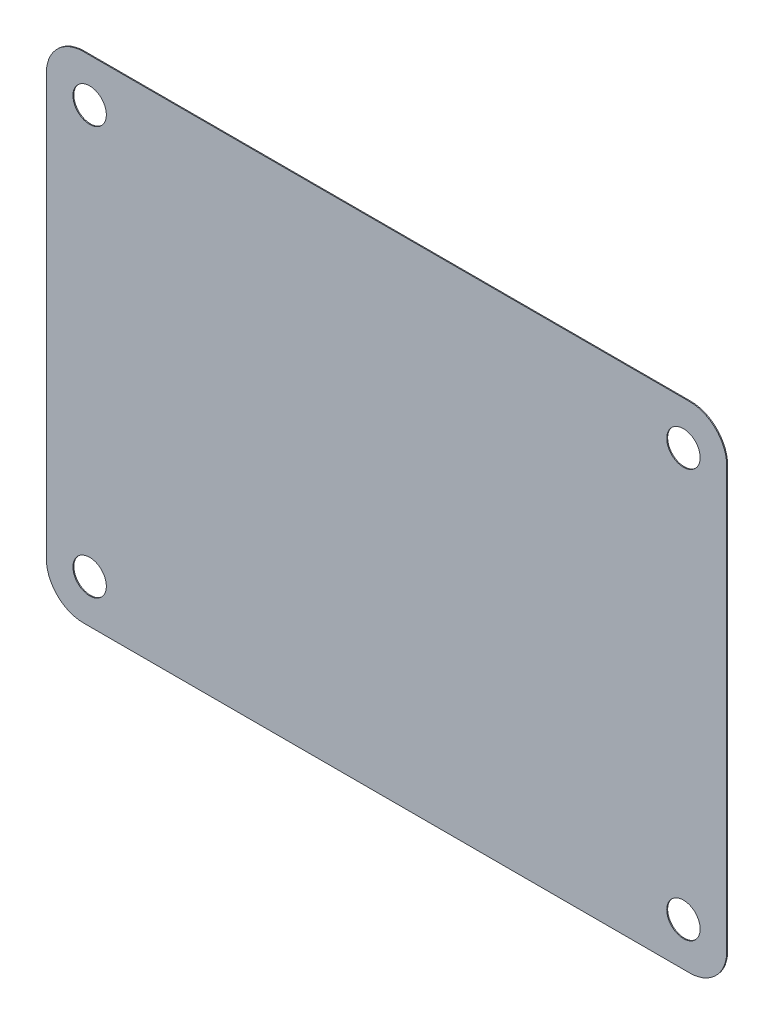
ISO-10303-21;
HEADER;
FILE_DESCRIPTION(('STEP AP214'),'2;1');
FILE_NAME('part.step','',(''),(''),'','','');
FILE_SCHEMA(('AUTOMOTIVE_DESIGN { 1 0 10303 214 1 1 1 1 }'));
ENDSEC;
DATA;
#1=APPLICATION_CONTEXT('core data for automotive mechanical design processes');
#2=APPLICATION_PROTOCOL_DEFINITION('international standard','automotive_design',2000,#1);
#3=PRODUCT_CONTEXT('',#1,'mechanical');
#4=PRODUCT('Part','Part','',(#3));
#5=PRODUCT_RELATED_PRODUCT_CATEGORY('part','',(#4));
#6=PRODUCT_DEFINITION_FORMATION('','',#4);
#7=PRODUCT_DEFINITION_CONTEXT('part definition',#1,'design');
#8=PRODUCT_DEFINITION('design','',#6,#7);
#9=PRODUCT_DEFINITION_SHAPE('','',#8);
#10=(LENGTH_UNIT() NAMED_UNIT(*) SI_UNIT(.MILLI.,.METRE.));
#11=(NAMED_UNIT(*) PLANE_ANGLE_UNIT() SI_UNIT($,.RADIAN.));
#12=(NAMED_UNIT(*) SI_UNIT($,.STERADIAN.) SOLID_ANGLE_UNIT());
#13=UNCERTAINTY_MEASURE_WITH_UNIT(LENGTH_MEASURE(1.E-05),#10,'distance_accuracy_value','');
#14=(GEOMETRIC_REPRESENTATION_CONTEXT(3) GLOBAL_UNCERTAINTY_ASSIGNED_CONTEXT((#13)) GLOBAL_UNIT_ASSIGNED_CONTEXT((#10,
#11,#12)) REPRESENTATION_CONTEXT('',''));
#15=CARTESIAN_POINT('',(0.,0.,0.));
#16=DIRECTION('',(0.,0.,1.));
#17=DIRECTION('',(1.,0.,0.));
#18=AXIS2_PLACEMENT_3D('',#15,#16,#17);
#19=CARTESIAN_POINT('',(27.499999555869,35.999999598533,0.1394000001));
#20=DIRECTION('',(0.,0.,1.));
#21=DIRECTION('',(1.,0.,0.));
#22=AXIS2_PLACEMENT_3D('',#19,#20,#21);
#23=PLANE('',#22);
#24=CARTESIAN_POINT('',(51.500000136726,52.499998525994,0.1394000001));
#25=DIRECTION('',(0.,0.,-1.));
#26=DIRECTION('',(1.,0.,0.));
#27=AXIS2_PLACEMENT_3D('',#24,#25,#26);
#28=CIRCLE('',#27,1.349999863275);
#29=CARTESIAN_POINT('',(52.850000000001,52.499998525994,0.1394000001));
#30=VERTEX_POINT('',#29);
#31=CARTESIAN_POINT('',(50.150000273451,52.499998525994,0.1394000001));
#32=VERTEX_POINT('',#31);
#33=EDGE_CURVE('E252',#30,#32,#28,.T.);
#34=ORIENTED_EDGE('',*,*,#33,.T.);
#35=CARTESIAN_POINT('',(51.500000136726,52.499998525994,0.1394000001));
#36=DIRECTION('',(0.,0.,-1.));
#37=DIRECTION('',(1.,0.,0.));
#38=AXIS2_PLACEMENT_3D('',#35,#36,#37);
#39=CIRCLE('',#38,1.349999863275);
#40=EDGE_CURVE('E11',#32,#30,#39,.T.);
#41=ORIENTED_EDGE('',*,*,#40,.T.);
#42=EDGE_LOOP('',(#34,#41));
#43=FACE_BOUND('',#42,.T.);
#44=CARTESIAN_POINT('',(3.500000092163,52.499999091341,0.1394000001));
#45=DIRECTION('',(0.,0.,-1.));
#46=DIRECTION('',(1.,0.,0.));
#47=AXIS2_PLACEMENT_3D('',#44,#45,#46);
#48=CIRCLE('',#47,1.349999907837);
#49=CARTESIAN_POINT('',(4.85,52.499999091341,0.1394000001));
#50=VERTEX_POINT('',#49);
#51=CARTESIAN_POINT('',(2.150000184326,52.499999091341,0.1394000001));
#52=VERTEX_POINT('',#51);
#53=EDGE_CURVE('E244',#50,#52,#48,.T.);
#54=ORIENTED_EDGE('',*,*,#53,.T.);
#55=CARTESIAN_POINT('',(3.500000092163,52.499999091341,0.1394000001));
#56=DIRECTION('',(0.,0.,-1.));
#57=DIRECTION('',(1.,0.,0.));
#58=AXIS2_PLACEMENT_3D('',#55,#56,#57);
#59=CIRCLE('',#58,1.349999907837);
#60=EDGE_CURVE('E28',#52,#50,#59,.T.);
#61=ORIENTED_EDGE('',*,*,#60,.T.);
#62=EDGE_LOOP('',(#54,#61));
#63=FACE_BOUND('',#62,.T.);
#64=CARTESIAN_POINT('',(51.500000136726,19.499998525994,0.1394000001));
#65=DIRECTION('',(0.,0.,-1.));
#66=DIRECTION('',(1.,0.,0.));
#67=AXIS2_PLACEMENT_3D('',#64,#65,#66);
#68=CIRCLE('',#67,1.349999863275);
#69=CARTESIAN_POINT('',(52.850000000001,19.499998525994,0.1394000001));
#70=VERTEX_POINT('',#69);
#71=CARTESIAN_POINT('',(50.150000273451,19.499998525994,0.1394000001));
#72=VERTEX_POINT('',#71);
#73=EDGE_CURVE('E226',#70,#72,#68,.T.);
#74=ORIENTED_EDGE('',*,*,#73,.T.);
#75=CARTESIAN_POINT('',(51.500000136726,19.499998525994,0.1394000001));
#76=DIRECTION('',(0.,0.,-1.));
#77=DIRECTION('',(1.,0.,0.));
#78=AXIS2_PLACEMENT_3D('',#75,#76,#77);
#79=CIRCLE('',#78,1.349999863275);
#80=EDGE_CURVE('E151',#72,#70,#79,.T.);
#81=ORIENTED_EDGE('',*,*,#80,.T.);
#82=EDGE_LOOP('',(#74,#81));
#83=FACE_BOUND('',#82,.T.);
#84=CARTESIAN_POINT('',(3.499999780028,19.496399991386,0.1394000001));
#85=DIRECTION('',(0.,0.,-1.));
#86=DIRECTION('',(1.,0.,0.));
#87=AXIS2_PLACEMENT_3D('',#84,#85,#86);
#88=CIRCLE('',#87,1.350000219972);
#89=CARTESIAN_POINT('',(4.85,19.496399991386,0.1394000001));
#90=VERTEX_POINT('',#89);
#91=CARTESIAN_POINT('',(2.149999560056,19.496399991386,0.1394000001));
#92=VERTEX_POINT('',#91);
#93=EDGE_CURVE('E239',#90,#92,#88,.T.);
#94=ORIENTED_EDGE('',*,*,#93,.T.);
#95=CARTESIAN_POINT('',(3.499999780028,19.496399991386,0.1394000001));
#96=DIRECTION('',(0.,0.,-1.));
#97=DIRECTION('',(1.,0.,0.));
#98=AXIS2_PLACEMENT_3D('',#95,#96,#97);
#99=CIRCLE('',#98,1.350000219972);
#100=EDGE_CURVE('E321',#92,#90,#99,.T.);
#101=ORIENTED_EDGE('',*,*,#100,.T.);
#102=EDGE_LOOP('',(#94,#101));
#103=FACE_BOUND('',#102,.T.);
#104=DIRECTION('',(0.,1.,0.));
#105=VECTOR('',#104,1.);
#106=CARTESIAN_POINT('',(55.,53.,0.1394000001));
#107=LINE('',#106,#105);
#108=CARTESIAN_POINT('',(55.,19.000001303345,0.1394000001));
#109=VERTEX_POINT('',#108);
#110=CARTESIAN_POINT('',(55.000000000004,52.999993225551,0.1394000001));
#111=VERTEX_POINT('',#110);
#112=EDGE_CURVE('E259',#109,#111,#107,.T.);
#113=ORIENTED_EDGE('',*,*,#112,.T.);
#114=CARTESIAN_POINT('',(51.999993225551,52.999993225551,0.1394000001));
#115=DIRECTION('',(0.,0.,-1.));
#116=DIRECTION('',(1.,0.,0.));
#117=AXIS2_PLACEMENT_3D('',#114,#115,#116);
#118=CIRCLE('',#117,3.000006774456);
#119=CARTESIAN_POINT('',(51.999996612776,56.,0.1394000001));
#120=VERTEX_POINT('',#119);
#121=EDGE_CURVE('E286',#120,#111,#118,.T.);
#122=ORIENTED_EDGE('',*,*,#121,.F.);
#123=DIRECTION('',(-1.,0.,0.));
#124=VECTOR('',#123,1.);
#125=CARTESIAN_POINT('',(3.,56.,0.1394000001));
#126=LINE('',#125,#124);
#127=CARTESIAN_POINT('',(3.000001694072,56.,0.1394000001));
#128=VERTEX_POINT('',#127);
#129=EDGE_CURVE('E290',#120,#128,#126,.T.);
#130=ORIENTED_EDGE('',*,*,#129,.T.);
#131=CARTESIAN_POINT('',(3.000003388144,52.999996611856,0.1394000001));
#132=DIRECTION('',(0.,0.,-1.));
#133=DIRECTION('',(1.,0.,0.));
#134=AXIS2_PLACEMENT_3D('',#131,#132,#133);
#135=CIRCLE('',#134,3.000003388146);
#136=CARTESIAN_POINT('',(0.,52.999998305928,0.1394000001));
#137=VERTEX_POINT('',#136);
#138=EDGE_CURVE('E42',#137,#128,#135,.T.);
#139=ORIENTED_EDGE('',*,*,#138,.F.);
#140=DIRECTION('',(0.,-1.,0.));
#141=VECTOR('',#140,1.);
#142=CARTESIAN_POINT('',(0.,19.,0.1394000001));
#143=LINE('',#142,#141);
#144=CARTESIAN_POINT('',(0.,18.9999996102,0.1394000001));
#145=VERTEX_POINT('',#144);
#146=EDGE_CURVE('E222',#137,#145,#143,.T.);
#147=ORIENTED_EDGE('',*,*,#146,.T.);
#148=CARTESIAN_POINT('',(2.999999220399,18.9999992204,0.1394000001));
#149=DIRECTION('',(0.,0.,-1.));
#150=DIRECTION('',(1.,0.,0.));
#151=AXIS2_PLACEMENT_3D('',#148,#149,#150);
#152=CIRCLE('',#151,2.9999992204);
#153=CARTESIAN_POINT('',(2.9999996102,16.,0.1394000001));
#154=VERTEX_POINT('',#153);
#155=EDGE_CURVE('E292',#154,#145,#152,.T.);
#156=ORIENTED_EDGE('',*,*,#155,.F.);
#157=DIRECTION('',(1.,0.,0.));
#158=VECTOR('',#157,1.);
#159=CARTESIAN_POINT('',(52.,16.,0.1394000001));
#160=LINE('',#159,#158);
#161=CARTESIAN_POINT('',(51.999998696655,16.,0.1394000001));
#162=VERTEX_POINT('',#161);
#163=EDGE_CURVE('E125',#154,#162,#160,.T.);
#164=ORIENTED_EDGE('',*,*,#163,.T.);
#165=CARTESIAN_POINT('',(51.999997393309,19.00000260669,0.1394000001));
#166=DIRECTION('',(0.,0.,-1.));
#167=DIRECTION('',(1.,0.,0.));
#168=AXIS2_PLACEMENT_3D('',#165,#166,#167);
#169=CIRCLE('',#168,3.000002606692);
#170=EDGE_CURVE('E133',#109,#162,#169,.T.);
#171=ORIENTED_EDGE('',*,*,#170,.F.);
#172=EDGE_LOOP('',(#113,#122,#130,#139,#147,#156,#164,#171));
#173=FACE_BOUND('',#172,.T.);
#174=ADVANCED_FACE('F17',(#43,#63,#83,#103,#173),#23,.T.);
#175=CARTESIAN_POINT('',(51.500000136726,52.499998525994,0.0654000001));
#176=DIRECTION('',(0.,0.,1.));
#177=DIRECTION('',(1.,0.,0.));
#178=AXIS2_PLACEMENT_3D('',#175,#176,#177);
#179=CYLINDRICAL_SURFACE('',#178,1.349999863275);
#180=DIRECTION('',(0.,0.,1.));
#181=VECTOR('',#180,1.);
#182=CARTESIAN_POINT('',(50.150000273451,52.499998525994,0.0654000001));
#183=LINE('',#182,#181);
#184=CARTESIAN_POINT('',(50.150000273451,52.499998525994,0.0654000001));
#185=VERTEX_POINT('',#184);
#186=EDGE_CURVE('E232',#185,#32,#183,.T.);
#187=ORIENTED_EDGE('',*,*,#186,.F.);
#188=CARTESIAN_POINT('',(51.500000136726,52.499998525994,0.0654000001));
#189=DIRECTION('',(0.,0.,-1.));
#190=DIRECTION('',(1.,0.,0.));
#191=AXIS2_PLACEMENT_3D('',#188,#189,#190);
#192=CIRCLE('',#191,1.349999863275);
#193=CARTESIAN_POINT('',(52.850000000001,52.499998525994,0.0654000001));
#194=VERTEX_POINT('',#193);
#195=EDGE_CURVE('E310',#185,#194,#192,.T.);
#196=ORIENTED_EDGE('',*,*,#195,.T.);
#197=DIRECTION('',(0.,0.,1.));
#198=VECTOR('',#197,1.);
#199=CARTESIAN_POINT('',(52.850000000001,52.499998525994,0.0654000001));
#200=LINE('',#199,#198);
#201=EDGE_CURVE('E256',#194,#30,#200,.T.);
#202=ORIENTED_EDGE('',*,*,#201,.T.);
#203=ORIENTED_EDGE('',*,*,#40,.F.);
#204=EDGE_LOOP('',(#187,#196,#202,#203));
#205=FACE_BOUND('',#204,.T.);
#206=ADVANCED_FACE('F377',(#205),#179,.F.);
#207=CARTESIAN_POINT('',(3.500000092163,52.499999091341,0.0654000001));
#208=DIRECTION('',(0.,0.,1.));
#209=DIRECTION('',(1.,0.,0.));
#210=AXIS2_PLACEMENT_3D('',#207,#208,#209);
#211=CYLINDRICAL_SURFACE('',#210,1.349999907837);
#212=DIRECTION('',(0.,0.,1.));
#213=VECTOR('',#212,1.);
#214=CARTESIAN_POINT('',(2.150000184326,52.499999091341,0.0654000001));
#215=LINE('',#214,#213);
#216=CARTESIAN_POINT('',(2.150000184326,52.499999091341,0.0654000001));
#217=VERTEX_POINT('',#216);
#218=EDGE_CURVE('E240',#217,#52,#215,.T.);
#219=ORIENTED_EDGE('',*,*,#218,.F.);
#220=CARTESIAN_POINT('',(3.500000092163,52.499999091341,0.0654000001));
#221=DIRECTION('',(0.,0.,-1.));
#222=DIRECTION('',(1.,0.,0.));
#223=AXIS2_PLACEMENT_3D('',#220,#221,#222);
#224=CIRCLE('',#223,1.349999907837);
#225=CARTESIAN_POINT('',(4.85,52.499999091341,0.0654000001));
#226=VERTEX_POINT('',#225);
#227=EDGE_CURVE('E313',#217,#226,#224,.T.);
#228=ORIENTED_EDGE('',*,*,#227,.T.);
#229=DIRECTION('',(0.,0.,1.));
#230=VECTOR('',#229,1.);
#231=CARTESIAN_POINT('',(4.85,52.499999091341,0.0654000001));
#232=LINE('',#231,#230);
#233=EDGE_CURVE('E233',#226,#50,#232,.T.);
#234=ORIENTED_EDGE('',*,*,#233,.T.);
#235=ORIENTED_EDGE('',*,*,#60,.F.);
#236=EDGE_LOOP('',(#219,#228,#234,#235));
#237=FACE_BOUND('',#236,.T.);
#238=ADVANCED_FACE('F425',(#237),#211,.F.);
#239=CARTESIAN_POINT('',(51.500000136726,19.499998525994,0.0654000001));
#240=DIRECTION('',(0.,0.,1.));
#241=DIRECTION('',(1.,0.,0.));
#242=AXIS2_PLACEMENT_3D('',#239,#240,#241);
#243=CYLINDRICAL_SURFACE('',#242,1.349999863275);
#244=DIRECTION('',(0.,0.,1.));
#245=VECTOR('',#244,1.);
#246=CARTESIAN_POINT('',(50.150000273451,19.499998525994,0.0654000001));
#247=LINE('',#246,#245);
#248=CARTESIAN_POINT('',(50.150000273451,19.499998525994,0.0654000001));
#249=VERTEX_POINT('',#248);
#250=EDGE_CURVE('E245',#249,#72,#247,.T.);
#251=ORIENTED_EDGE('',*,*,#250,.F.);
#252=CARTESIAN_POINT('',(51.500000136726,19.499998525994,0.0654000001));
#253=DIRECTION('',(0.,0.,-1.));
#254=DIRECTION('',(1.,0.,0.));
#255=AXIS2_PLACEMENT_3D('',#252,#253,#254);
#256=CIRCLE('',#255,1.349999863275);
#257=CARTESIAN_POINT('',(52.850000000001,19.499998525994,0.0654000001));
#258=VERTEX_POINT('',#257);
#259=EDGE_CURVE('E341',#249,#258,#256,.T.);
#260=ORIENTED_EDGE('',*,*,#259,.T.);
#261=DIRECTION('',(0.,0.,1.));
#262=VECTOR('',#261,1.);
#263=CARTESIAN_POINT('',(52.850000000001,19.499998525994,0.0654000001));
#264=LINE('',#263,#262);
#265=EDGE_CURVE('E223',#258,#70,#264,.T.);
#266=ORIENTED_EDGE('',*,*,#265,.T.);
#267=ORIENTED_EDGE('',*,*,#80,.F.);
#268=EDGE_LOOP('',(#251,#260,#266,#267));
#269=FACE_BOUND('',#268,.T.);
#270=ADVANCED_FACE('F421',(#269),#243,.F.);
#271=CARTESIAN_POINT('',(3.499999780028,19.496399991386,0.0654000001));
#272=DIRECTION('',(0.,0.,1.));
#273=DIRECTION('',(1.,0.,0.));
#274=AXIS2_PLACEMENT_3D('',#271,#272,#273);
#275=CYLINDRICAL_SURFACE('',#274,1.350000219972);
#276=DIRECTION('',(0.,0.,1.));
#277=VECTOR('',#276,1.);
#278=CARTESIAN_POINT('',(2.149999560056,19.496399991386,0.0654000001));
#279=LINE('',#278,#277);
#280=CARTESIAN_POINT('',(2.149999560056,19.496399991386,0.0654000001));
#281=VERTEX_POINT('',#280);
#282=EDGE_CURVE('E306',#281,#92,#279,.T.);
#283=ORIENTED_EDGE('',*,*,#282,.F.);
#284=CARTESIAN_POINT('',(3.499999780028,19.496399991386,0.0654000001));
#285=DIRECTION('',(0.,0.,-1.));
#286=DIRECTION('',(1.,0.,0.));
#287=AXIS2_PLACEMENT_3D('',#284,#285,#286);
#288=CIRCLE('',#287,1.350000219972);
#289=CARTESIAN_POINT('',(4.85,19.496399991386,0.0654000001));
#290=VERTEX_POINT('',#289);
#291=EDGE_CURVE('E21',#281,#290,#288,.T.);
#292=ORIENTED_EDGE('',*,*,#291,.T.);
#293=DIRECTION('',(0.,0.,1.));
#294=VECTOR('',#293,1.);
#295=CARTESIAN_POINT('',(4.85,19.496399991386,0.0654000001));
#296=LINE('',#295,#294);
#297=EDGE_CURVE('E234',#290,#90,#296,.T.);
#298=ORIENTED_EDGE('',*,*,#297,.T.);
#299=ORIENTED_EDGE('',*,*,#100,.F.);
#300=EDGE_LOOP('',(#283,#292,#298,#299));
#301=FACE_BOUND('',#300,.T.);
#302=ADVANCED_FACE('F374',(#301),#275,.F.);
#303=CARTESIAN_POINT('',(3.000003388144,52.999996611856,0.0654000001));
#304=DIRECTION('',(0.,0.,1.));
#305=DIRECTION('',(1.,0.,0.));
#306=AXIS2_PLACEMENT_3D('',#303,#304,#305);
#307=CYLINDRICAL_SURFACE('',#306,3.000003388146);
#308=CARTESIAN_POINT('',(3.000003388144,52.999996611856,0.0654000001));
#309=DIRECTION('',(0.,0.,1.));
#310=DIRECTION('',(1.,0.,0.));
#311=AXIS2_PLACEMENT_3D('',#308,#309,#310);
#312=CIRCLE('',#311,3.000003388146);
#313=CARTESIAN_POINT('',(3.000001694072,56.,0.0654000001));
#314=VERTEX_POINT('',#313);
#315=CARTESIAN_POINT('',(0.,52.999998305928,0.0654000001));
#316=VERTEX_POINT('',#315);
#317=EDGE_CURVE('E260',#314,#316,#312,.T.);
#318=ORIENTED_EDGE('',*,*,#317,.T.);
#319=DIRECTION('',(0.,0.,1.));
#320=VECTOR('',#319,1.);
#321=CARTESIAN_POINT('',(0.,53.,0.0654000001));
#322=LINE('',#321,#320);
#323=EDGE_CURVE('E218',#316,#137,#322,.T.);
#324=ORIENTED_EDGE('',*,*,#323,.T.);
#325=ORIENTED_EDGE('',*,*,#138,.T.);
#326=DIRECTION('',(0.,0.,-1.));
#327=VECTOR('',#326,1.);
#328=CARTESIAN_POINT('',(3.,56.,0.0654000001));
#329=LINE('',#328,#327);
#330=EDGE_CURVE('E287',#128,#314,#329,.T.);
#331=ORIENTED_EDGE('',*,*,#330,.T.);
#332=EDGE_LOOP('',(#318,#324,#325,#331));
#333=FACE_BOUND('',#332,.T.);
#334=ADVANCED_FACE('F432',(#333),#307,.T.);
#335=CARTESIAN_POINT('',(0.,19.,0.0654000001));
#336=DIRECTION('',(1.,0.,0.));
#337=DIRECTION('',(0.,1.,0.));
#338=AXIS2_PLACEMENT_3D('',#335,#336,#337);
#339=PLANE('',#338);
#340=ORIENTED_EDGE('',*,*,#323,.F.);
#341=DIRECTION('',(0.,-1.,0.));
#342=VECTOR('',#341,1.);
#343=CARTESIAN_POINT('',(0.,35.999999598533,0.0654000001));
#344=LINE('',#343,#342);
#345=CARTESIAN_POINT('',(0.,18.9999996102,0.0654000001));
#346=VERTEX_POINT('',#345);
#347=EDGE_CURVE('E200',#316,#346,#344,.T.);
#348=ORIENTED_EDGE('',*,*,#347,.T.);
#349=DIRECTION('',(0.,0.,-1.));
#350=VECTOR('',#349,1.);
#351=CARTESIAN_POINT('',(0.,19.,0.0654000001));
#352=LINE('',#351,#350);
#353=EDGE_CURVE('E177',#145,#346,#352,.T.);
#354=ORIENTED_EDGE('',*,*,#353,.F.);
#355=ORIENTED_EDGE('',*,*,#146,.F.);
#356=EDGE_LOOP('',(#340,#348,#354,#355));
#357=FACE_BOUND('',#356,.T.);
#358=ADVANCED_FACE('F536',(#357),#339,.F.);
#359=CARTESIAN_POINT('',(2.999999220399,18.9999992204,0.0654000001));
#360=DIRECTION('',(0.,0.,1.));
#361=DIRECTION('',(1.,0.,0.));
#362=AXIS2_PLACEMENT_3D('',#359,#360,#361);
#363=CYLINDRICAL_SURFACE('',#362,2.9999992204);
#364=CARTESIAN_POINT('',(2.999999220399,18.9999992204,0.0654000001));
#365=DIRECTION('',(0.,0.,1.));
#366=DIRECTION('',(1.,0.,0.));
#367=AXIS2_PLACEMENT_3D('',#364,#365,#366);
#368=CIRCLE('',#367,2.9999992204);
#369=CARTESIAN_POINT('',(2.9999996102,16.,0.0654000001));
#370=VERTEX_POINT('',#369);
#371=EDGE_CURVE('E195',#346,#370,#368,.T.);
#372=ORIENTED_EDGE('',*,*,#371,.T.);
#373=DIRECTION('',(0.,0.,1.));
#374=VECTOR('',#373,1.);
#375=CARTESIAN_POINT('',(3.,16.,0.0654000001));
#376=LINE('',#375,#374);
#377=EDGE_CURVE('E186',#370,#154,#376,.T.);
#378=ORIENTED_EDGE('',*,*,#377,.T.);
#379=ORIENTED_EDGE('',*,*,#155,.T.);
#380=ORIENTED_EDGE('',*,*,#353,.T.);
#381=EDGE_LOOP('',(#372,#378,#379,#380));
#382=FACE_BOUND('',#381,.T.);
#383=ADVANCED_FACE('F196',(#382),#363,.T.);
#384=CARTESIAN_POINT('',(52.,16.,0.0654000001));
#385=DIRECTION('',(0.,1.,0.));
#386=DIRECTION('',(1.,0.,0.));
#387=AXIS2_PLACEMENT_3D('',#384,#385,#386);
#388=PLANE('',#387);
#389=ORIENTED_EDGE('',*,*,#377,.F.);
#390=DIRECTION('',(1.,0.,0.));
#391=VECTOR('',#390,1.);
#392=CARTESIAN_POINT('',(27.499999555869,16.,0.0654000001));
#393=LINE('',#392,#391);
#394=CARTESIAN_POINT('',(51.999998696655,16.,0.0654000001));
#395=VERTEX_POINT('',#394);
#396=EDGE_CURVE('E189',#370,#395,#393,.T.);
#397=ORIENTED_EDGE('',*,*,#396,.T.);
#398=DIRECTION('',(0.,0.,-1.));
#399=VECTOR('',#398,1.);
#400=CARTESIAN_POINT('',(52.,16.,0.0654000001));
#401=LINE('',#400,#399);
#402=EDGE_CURVE('E192',#162,#395,#401,.T.);
#403=ORIENTED_EDGE('',*,*,#402,.F.);
#404=ORIENTED_EDGE('',*,*,#163,.F.);
#405=EDGE_LOOP('',(#389,#397,#403,#404));
#406=FACE_BOUND('',#405,.T.);
#407=ADVANCED_FACE('F187',(#406),#388,.F.);
#408=CARTESIAN_POINT('',(51.999997393309,19.00000260669,0.0654000001));
#409=DIRECTION('',(0.,0.,1.));
#410=DIRECTION('',(1.,0.,0.));
#411=AXIS2_PLACEMENT_3D('',#408,#409,#410);
#412=CYLINDRICAL_SURFACE('',#411,3.000002606692);
#413=CARTESIAN_POINT('',(51.999997393309,19.00000260669,0.0654000001));
#414=DIRECTION('',(0.,0.,1.));
#415=DIRECTION('',(1.,0.,0.));
#416=AXIS2_PLACEMENT_3D('',#413,#414,#415);
#417=CIRCLE('',#416,3.000002606692);
#418=CARTESIAN_POINT('',(55.,19.000001303345,0.0654000001));
#419=VERTEX_POINT('',#418);
#420=EDGE_CURVE('E206',#395,#419,#417,.T.);
#421=ORIENTED_EDGE('',*,*,#420,.T.);
#422=DIRECTION('',(0.,0.,1.));
#423=VECTOR('',#422,1.);
#424=CARTESIAN_POINT('',(55.,19.,0.0654000001));
#425=LINE('',#424,#423);
#426=EDGE_CURVE('E285',#419,#109,#425,.T.);
#427=ORIENTED_EDGE('',*,*,#426,.T.);
#428=ORIENTED_EDGE('',*,*,#170,.T.);
#429=ORIENTED_EDGE('',*,*,#402,.T.);
#430=EDGE_LOOP('',(#421,#427,#428,#429));
#431=FACE_BOUND('',#430,.T.);
#432=ADVANCED_FACE('F384',(#431),#412,.T.);
#433=CARTESIAN_POINT('',(55.,53.,0.0654000001));
#434=DIRECTION('',(-1.,0.,0.));
#435=DIRECTION('',(0.,0.,1.));
#436=AXIS2_PLACEMENT_3D('',#433,#434,#435);
#437=PLANE('',#436);
#438=ORIENTED_EDGE('',*,*,#426,.F.);
#439=DIRECTION('',(0.,1.,0.));
#440=VECTOR('',#439,1.);
#441=CARTESIAN_POINT('',(55.,35.999999598533,0.0654000001));
#442=LINE('',#441,#440);
#443=CARTESIAN_POINT('',(55.000000000004,52.999993225551,0.0654000001));
#444=VERTEX_POINT('',#443);
#445=EDGE_CURVE('E213',#419,#444,#442,.T.);
#446=ORIENTED_EDGE('',*,*,#445,.T.);
#447=DIRECTION('',(0.,0.,-1.));
#448=VECTOR('',#447,1.);
#449=CARTESIAN_POINT('',(55.000000000008,52.999993225551,0.0654000001));
#450=LINE('',#449,#448);
#451=EDGE_CURVE('E282',#111,#444,#450,.T.);
#452=ORIENTED_EDGE('',*,*,#451,.F.);
#453=ORIENTED_EDGE('',*,*,#112,.F.);
#454=EDGE_LOOP('',(#438,#446,#452,#453));
#455=FACE_BOUND('',#454,.T.);
#456=ADVANCED_FACE('F382',(#455),#437,.F.);
#457=CARTESIAN_POINT('',(51.999993225551,52.999993225551,0.0654000001));
#458=DIRECTION('',(0.,0.,1.));
#459=DIRECTION('',(1.,0.,0.));
#460=AXIS2_PLACEMENT_3D('',#457,#458,#459);
#461=CYLINDRICAL_SURFACE('',#460,3.000006774456);
#462=CARTESIAN_POINT('',(51.999993225551,52.999993225551,0.0654000001));
#463=DIRECTION('',(0.,0.,1.));
#464=DIRECTION('',(1.,0.,0.));
#465=AXIS2_PLACEMENT_3D('',#462,#463,#464);
#466=CIRCLE('',#465,3.000006774456);
#467=CARTESIAN_POINT('',(51.999996612776,56.,0.0654000001));
#468=VERTEX_POINT('',#467);
#469=EDGE_CURVE('E295',#444,#468,#466,.T.);
#470=ORIENTED_EDGE('',*,*,#469,.T.);
#471=DIRECTION('',(0.,0.,1.));
#472=VECTOR('',#471,1.);
#473=CARTESIAN_POINT('',(52.,56.,0.0654000001));
#474=LINE('',#473,#472);
#475=EDGE_CURVE('E291',#468,#120,#474,.T.);
#476=ORIENTED_EDGE('',*,*,#475,.T.);
#477=ORIENTED_EDGE('',*,*,#121,.T.);
#478=ORIENTED_EDGE('',*,*,#451,.T.);
#479=EDGE_LOOP('',(#470,#476,#477,#478));
#480=FACE_BOUND('',#479,.T.);
#481=ADVANCED_FACE('F328',(#480),#461,.T.);
#482=CARTESIAN_POINT('',(3.,56.,0.0654000001));
#483=DIRECTION('',(0.,-1.,0.));
#484=DIRECTION('',(0.,0.,-1.));
#485=AXIS2_PLACEMENT_3D('',#482,#483,#484);
#486=PLANE('',#485);
#487=ORIENTED_EDGE('',*,*,#475,.F.);
#488=DIRECTION('',(-1.,0.,0.));
#489=VECTOR('',#488,1.);
#490=CARTESIAN_POINT('',(27.499999555869,56.,0.0654000001));
#491=LINE('',#490,#489);
#492=EDGE_CURVE('E264',#468,#314,#491,.T.);
#493=ORIENTED_EDGE('',*,*,#492,.T.);
#494=ORIENTED_EDGE('',*,*,#330,.F.);
#495=ORIENTED_EDGE('',*,*,#129,.F.);
#496=EDGE_LOOP('',(#487,#493,#494,#495));
#497=FACE_BOUND('',#496,.T.);
#498=ADVANCED_FACE('F333',(#497),#486,.F.);
#499=CARTESIAN_POINT('',(27.499999555869,35.999999598533,0.0654000001));
#500=DIRECTION('',(0.,0.,1.));
#501=DIRECTION('',(1.,0.,0.));
#502=AXIS2_PLACEMENT_3D('',#499,#500,#501);
#503=PLANE('',#502);
#504=CARTESIAN_POINT('',(51.500000136726,52.499998525994,0.0654000001));
#505=DIRECTION('',(0.,0.,-1.));
#506=DIRECTION('',(1.,0.,0.));
#507=AXIS2_PLACEMENT_3D('',#504,#505,#506);
#508=CIRCLE('',#507,1.349999863275);
#509=EDGE_CURVE('E228',#194,#185,#508,.T.);
#510=ORIENTED_EDGE('',*,*,#509,.F.);
#511=ORIENTED_EDGE('',*,*,#195,.F.);
#512=EDGE_LOOP('',(#510,#511));
#513=FACE_BOUND('',#512,.T.);
#514=CARTESIAN_POINT('',(3.500000092163,52.499999091341,0.0654000001));
#515=DIRECTION('',(0.,0.,-1.));
#516=DIRECTION('',(1.,0.,0.));
#517=AXIS2_PLACEMENT_3D('',#514,#515,#516);
#518=CIRCLE('',#517,1.349999907837);
#519=EDGE_CURVE('E225',#226,#217,#518,.T.);
#520=ORIENTED_EDGE('',*,*,#519,.F.);
#521=ORIENTED_EDGE('',*,*,#227,.F.);
#522=EDGE_LOOP('',(#520,#521));
#523=FACE_BOUND('',#522,.T.);
#524=CARTESIAN_POINT('',(51.500000136726,19.499998525994,0.0654000001));
#525=DIRECTION('',(0.,0.,-1.));
#526=DIRECTION('',(1.,0.,0.));
#527=AXIS2_PLACEMENT_3D('',#524,#525,#526);
#528=CIRCLE('',#527,1.349999863275);
#529=EDGE_CURVE('E238',#258,#249,#528,.T.);
#530=ORIENTED_EDGE('',*,*,#529,.F.);
#531=ORIENTED_EDGE('',*,*,#259,.F.);
#532=EDGE_LOOP('',(#530,#531));
#533=FACE_BOUND('',#532,.T.);
#534=CARTESIAN_POINT('',(3.499999780028,19.496399991386,0.0654000001));
#535=DIRECTION('',(0.,0.,-1.));
#536=DIRECTION('',(1.,0.,0.));
#537=AXIS2_PLACEMENT_3D('',#534,#535,#536);
#538=CIRCLE('',#537,1.350000219972);
#539=EDGE_CURVE('E302',#290,#281,#538,.T.);
#540=ORIENTED_EDGE('',*,*,#539,.F.);
#541=ORIENTED_EDGE('',*,*,#291,.F.);
#542=EDGE_LOOP('',(#540,#541));
#543=FACE_BOUND('',#542,.T.);
#544=ORIENTED_EDGE('',*,*,#469,.F.);
#545=ORIENTED_EDGE('',*,*,#445,.F.);
#546=ORIENTED_EDGE('',*,*,#420,.F.);
#547=ORIENTED_EDGE('',*,*,#396,.F.);
#548=ORIENTED_EDGE('',*,*,#371,.F.);
#549=ORIENTED_EDGE('',*,*,#347,.F.);
#550=ORIENTED_EDGE('',*,*,#317,.F.);
#551=ORIENTED_EDGE('',*,*,#492,.F.);
#552=EDGE_LOOP('',(#544,#545,#546,#547,#548,#549,#550,#551));
#553=FACE_BOUND('',#552,.T.);
#554=ADVANCED_FACE('F203',(#513,#523,#533,#543,#553),#503,.F.);
#555=CARTESIAN_POINT('',(51.500000136726,52.499998525994,0.0654000001));
#556=DIRECTION('',(0.,0.,1.));
#557=DIRECTION('',(1.,0.,0.));
#558=AXIS2_PLACEMENT_3D('',#555,#556,#557);
#559=CYLINDRICAL_SURFACE('',#558,1.349999863275);
#560=ORIENTED_EDGE('',*,*,#509,.T.);
#561=ORIENTED_EDGE('',*,*,#186,.T.);
#562=ORIENTED_EDGE('',*,*,#33,.F.);
#563=ORIENTED_EDGE('',*,*,#201,.F.);
#564=EDGE_LOOP('',(#560,#561,#562,#563));
#565=FACE_BOUND('',#564,.T.);
#566=ADVANCED_FACE('F397',(#565),#559,.F.);
#567=CARTESIAN_POINT('',(3.500000092163,52.499999091341,0.0654000001));
#568=DIRECTION('',(0.,0.,1.));
#569=DIRECTION('',(1.,0.,0.));
#570=AXIS2_PLACEMENT_3D('',#567,#568,#569);
#571=CYLINDRICAL_SURFACE('',#570,1.349999907837);
#572=ORIENTED_EDGE('',*,*,#519,.T.);
#573=ORIENTED_EDGE('',*,*,#218,.T.);
#574=ORIENTED_EDGE('',*,*,#53,.F.);
#575=ORIENTED_EDGE('',*,*,#233,.F.);
#576=EDGE_LOOP('',(#572,#573,#574,#575));
#577=FACE_BOUND('',#576,.T.);
#578=ADVANCED_FACE('F399',(#577),#571,.F.);
#579=CARTESIAN_POINT('',(51.500000136726,19.499998525994,0.0654000001));
#580=DIRECTION('',(0.,0.,1.));
#581=DIRECTION('',(1.,0.,0.));
#582=AXIS2_PLACEMENT_3D('',#579,#580,#581);
#583=CYLINDRICAL_SURFACE('',#582,1.349999863275);
#584=ORIENTED_EDGE('',*,*,#529,.T.);
#585=ORIENTED_EDGE('',*,*,#250,.T.);
#586=ORIENTED_EDGE('',*,*,#73,.F.);
#587=ORIENTED_EDGE('',*,*,#265,.F.);
#588=EDGE_LOOP('',(#584,#585,#586,#587));
#589=FACE_BOUND('',#588,.T.);
#590=ADVANCED_FACE('F19',(#589),#583,.F.);
#591=CARTESIAN_POINT('',(3.499999780028,19.496399991386,0.0654000001));
#592=DIRECTION('',(0.,0.,1.));
#593=DIRECTION('',(1.,0.,0.));
#594=AXIS2_PLACEMENT_3D('',#591,#592,#593);
#595=CYLINDRICAL_SURFACE('',#594,1.350000219972);
#596=ORIENTED_EDGE('',*,*,#539,.T.);
#597=ORIENTED_EDGE('',*,*,#282,.T.);
#598=ORIENTED_EDGE('',*,*,#93,.F.);
#599=ORIENTED_EDGE('',*,*,#297,.F.);
#600=EDGE_LOOP('',(#596,#597,#598,#599));
#601=FACE_BOUND('',#600,.T.);
#602=ADVANCED_FACE('F369',(#601),#595,.F.);
#603=CLOSED_SHELL('',(#174,#206,#238,#270,#302,#334,#358,#383,#407,#432,#456,#481,#498,#554,
#566,#578,#590,#602));
#604=MANIFOLD_SOLID_BREP('B1',#603);
#605=ADVANCED_BREP_SHAPE_REPRESENTATION('',(#18,#604),#14);
#606=SHAPE_DEFINITION_REPRESENTATION(#9,#605);
ENDSEC;
END-ISO-10303-21;
